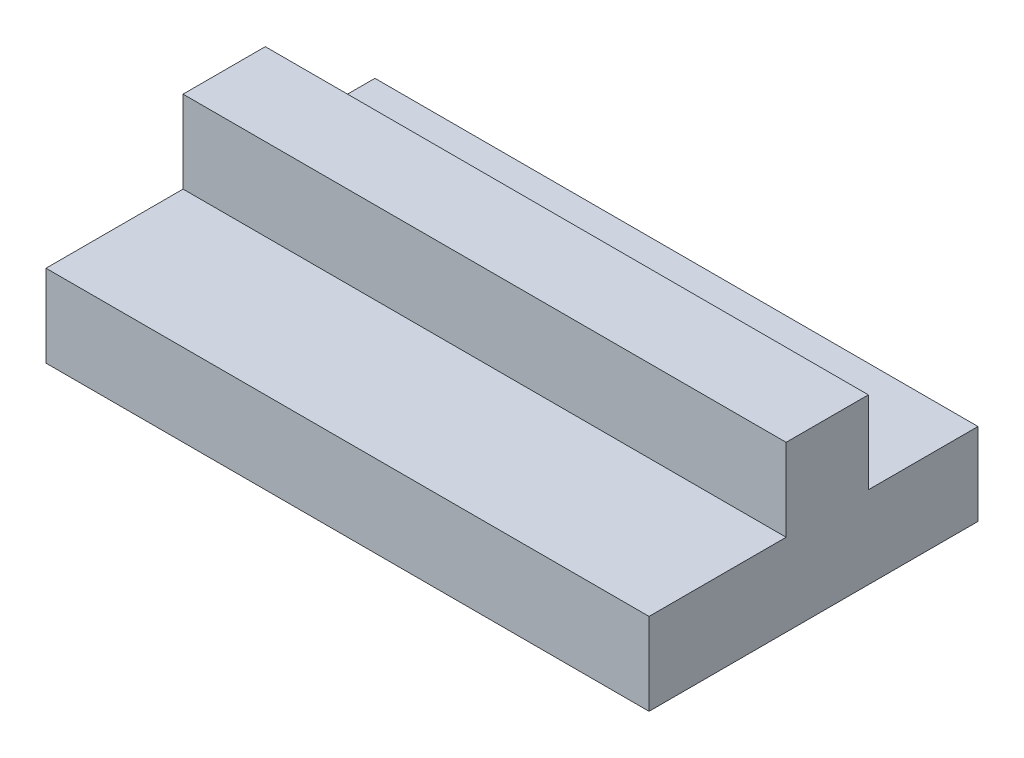
ISO-10303-21;
HEADER;
FILE_DESCRIPTION(('STEP AP214'),'2;1');
FILE_NAME('part.step','',(''),(''),'','','');
FILE_SCHEMA(('AUTOMOTIVE_DESIGN { 1 0 10303 214 1 1 1 1 }'));
ENDSEC;
DATA;
#1=APPLICATION_CONTEXT('core data for automotive mechanical design processes');
#2=APPLICATION_PROTOCOL_DEFINITION('international standard','automotive_design',2000,#1);
#3=PRODUCT_CONTEXT('',#1,'mechanical');
#4=PRODUCT('Part','Part','',(#3));
#5=PRODUCT_RELATED_PRODUCT_CATEGORY('part','',(#4));
#6=PRODUCT_DEFINITION_FORMATION('','',#4);
#7=PRODUCT_DEFINITION_CONTEXT('part definition',#1,'design');
#8=PRODUCT_DEFINITION('design','',#6,#7);
#9=PRODUCT_DEFINITION_SHAPE('','',#8);
#10=(LENGTH_UNIT() NAMED_UNIT(*) SI_UNIT(.MILLI.,.METRE.));
#11=(NAMED_UNIT(*) PLANE_ANGLE_UNIT() SI_UNIT($,.RADIAN.));
#12=(NAMED_UNIT(*) SI_UNIT($,.STERADIAN.) SOLID_ANGLE_UNIT());
#13=UNCERTAINTY_MEASURE_WITH_UNIT(LENGTH_MEASURE(1.E-05),#10,'distance_accuracy_value','');
#14=(GEOMETRIC_REPRESENTATION_CONTEXT(3) GLOBAL_UNCERTAINTY_ASSIGNED_CONTEXT((#13)) GLOBAL_UNIT_ASSIGNED_CONTEXT((#10,
#11,#12)) REPRESENTATION_CONTEXT('',''));
#15=CARTESIAN_POINT('',(0.,0.,0.));
#16=DIRECTION('',(0.,0.,1.));
#17=DIRECTION('',(1.,0.,0.));
#18=AXIS2_PLACEMENT_3D('',#15,#16,#17);
#19=CARTESIAN_POINT('',(-103.,0.,24.5));
#20=DIRECTION('',(0.,-1.,0.));
#21=DIRECTION('',(0.,0.,-1.));
#22=AXIS2_PLACEMENT_3D('',#19,#20,#21);
#23=PLANE('',#22);
#24=DIRECTION('',(0.,0.,1.));
#25=VECTOR('',#24,1.);
#26=CARTESIAN_POINT('',(25.6,0.,24.5));
#27=LINE('',#26,#25);
#28=CARTESIAN_POINT('',(25.6,0.,21.5));
#29=VERTEX_POINT('',#28);
#30=CARTESIAN_POINT('',(25.6,0.,26.5));
#31=VERTEX_POINT('',#30);
#32=EDGE_CURVE('E225',#29,#31,#27,.T.);
#33=ORIENTED_EDGE('',*,*,#32,.F.);
#34=DIRECTION('',(1.,0.,0.));
#35=VECTOR('',#34,1.);
#36=CARTESIAN_POINT('',(-103.,0.,21.5));
#37=LINE('',#36,#35);
#38=CARTESIAN_POINT('',(3.60000000000001,0.,21.5));
#39=VERTEX_POINT('',#38);
#40=EDGE_CURVE('E293',#39,#29,#37,.T.);
#41=ORIENTED_EDGE('',*,*,#40,.F.);
#42=DIRECTION('',(0.,0.,-1.));
#43=VECTOR('',#42,1.);
#44=CARTESIAN_POINT('',(3.60000000000001,0.,24.5));
#45=LINE('',#44,#43);
#46=CARTESIAN_POINT('',(3.60000000000001,0.,26.5));
#47=VERTEX_POINT('',#46);
#48=EDGE_CURVE('E218',#47,#39,#45,.T.);
#49=ORIENTED_EDGE('',*,*,#48,.F.);
#50=DIRECTION('',(-1.,0.,0.));
#51=VECTOR('',#50,1.);
#52=CARTESIAN_POINT('',(103.,0.,26.5));
#53=LINE('',#52,#51);
#54=EDGE_CURVE('E299',#31,#47,#53,.T.);
#55=ORIENTED_EDGE('',*,*,#54,.F.);
#56=EDGE_LOOP('',(#33,#41,#49,#55));
#57=FACE_BOUND('',#56,.T.);
#58=ADVANCED_FACE('F69',(#57),#23,.F.);
#59=CARTESIAN_POINT('',(103.,-3.,26.5));
#60=DIRECTION('',(0.,0.,-1.));
#61=DIRECTION('',(-1.,0.,0.));
#62=AXIS2_PLACEMENT_3D('',#59,#60,#61);
#63=PLANE('',#62);
#64=DIRECTION('',(0.,-1.,0.));
#65=VECTOR('',#64,1.);
#66=CARTESIAN_POINT('',(25.6,3.,26.5));
#67=LINE('',#66,#65);
#68=CARTESIAN_POINT('',(25.6,-3.,26.5));
#69=VERTEX_POINT('',#68);
#70=EDGE_CURVE('E211',#31,#69,#67,.T.);
#71=ORIENTED_EDGE('',*,*,#70,.F.);
#72=ORIENTED_EDGE('',*,*,#54,.T.);
#73=DIRECTION('',(0.,-1.,0.));
#74=VECTOR('',#73,1.);
#75=CARTESIAN_POINT('',(3.60000000000001,3.,26.5));
#76=LINE('',#75,#74);
#77=CARTESIAN_POINT('',(3.60000000000001,-3.,26.5));
#78=VERTEX_POINT('',#77);
#79=EDGE_CURVE('E189',#47,#78,#76,.T.);
#80=ORIENTED_EDGE('',*,*,#79,.T.);
#81=DIRECTION('',(-1.,0.,0.));
#82=VECTOR('',#81,1.);
#83=CARTESIAN_POINT('',(103.,-3.,26.5));
#84=LINE('',#83,#82);
#85=EDGE_CURVE('E203',#69,#78,#84,.T.);
#86=ORIENTED_EDGE('',*,*,#85,.F.);
#87=EDGE_LOOP('',(#71,#72,#80,#86));
#88=FACE_BOUND('',#87,.T.);
#89=ADVANCED_FACE('F71',(#88),#63,.F.);
#90=CARTESIAN_POINT('',(-103.,-3.,24.5));
#91=DIRECTION('',(0.,-1.,0.));
#92=DIRECTION('',(0.,0.,-1.));
#93=AXIS2_PLACEMENT_3D('',#90,#91,#92);
#94=PLANE('',#93);
#95=DIRECTION('',(0.,0.,1.));
#96=VECTOR('',#95,1.);
#97=CARTESIAN_POINT('',(12.6,-3.,15.8));
#98=LINE('',#97,#96);
#99=CARTESIAN_POINT('',(12.6,-3.,15.8));
#100=VERTEX_POINT('',#99);
#101=CARTESIAN_POINT('',(12.6,-3.,18.));
#102=VERTEX_POINT('',#101);
#103=EDGE_CURVE('E92',#100,#102,#98,.T.);
#104=ORIENTED_EDGE('',*,*,#103,.F.);
#105=DIRECTION('',(1.,0.,0.));
#106=VECTOR('',#105,1.);
#107=CARTESIAN_POINT('',(8.4,-3.,15.8));
#108=LINE('',#107,#106);
#109=CARTESIAN_POINT('',(8.4,-3.,15.8));
#110=VERTEX_POINT('',#109);
#111=EDGE_CURVE('E232',#110,#100,#108,.T.);
#112=ORIENTED_EDGE('',*,*,#111,.F.);
#113=DIRECTION('',(0.,0.,-1.));
#114=VECTOR('',#113,1.);
#115=CARTESIAN_POINT('',(8.4,-3.,15.8));
#116=LINE('',#115,#114);
#117=CARTESIAN_POINT('',(8.4,-3.,18.));
#118=VERTEX_POINT('',#117);
#119=EDGE_CURVE('E247',#118,#110,#116,.T.);
#120=ORIENTED_EDGE('',*,*,#119,.F.);
#121=DIRECTION('',(-1.,0.,0.));
#122=VECTOR('',#121,1.);
#123=CARTESIAN_POINT('',(8.4,-3.,18.));
#124=LINE('',#123,#122);
#125=EDGE_CURVE('E243',#102,#118,#124,.T.);
#126=ORIENTED_EDGE('',*,*,#125,.F.);
#127=EDGE_LOOP('',(#104,#112,#120,#126));
#128=FACE_BOUND('',#127,.T.);
#129=DIRECTION('',(0.,0.,1.));
#130=VECTOR('',#129,1.);
#131=CARTESIAN_POINT('',(20.6,-3.,15.8));
#132=LINE('',#131,#130);
#133=CARTESIAN_POINT('',(20.6,-3.,15.8));
#134=VERTEX_POINT('',#133);
#135=CARTESIAN_POINT('',(20.6,-3.,18.));
#136=VERTEX_POINT('',#135);
#137=EDGE_CURVE('E244',#134,#136,#132,.T.);
#138=ORIENTED_EDGE('',*,*,#137,.F.);
#139=DIRECTION('',(1.,0.,0.));
#140=VECTOR('',#139,1.);
#141=CARTESIAN_POINT('',(20.6,-3.,15.8));
#142=LINE('',#141,#140);
#143=CARTESIAN_POINT('',(16.4,-3.,15.8));
#144=VERTEX_POINT('',#143);
#145=EDGE_CURVE('E269',#144,#134,#142,.T.);
#146=ORIENTED_EDGE('',*,*,#145,.F.);
#147=DIRECTION('',(0.,0.,-1.));
#148=VECTOR('',#147,1.);
#149=CARTESIAN_POINT('',(16.4,-3.,15.8));
#150=LINE('',#149,#148);
#151=CARTESIAN_POINT('',(16.4,-3.,18.));
#152=VERTEX_POINT('',#151);
#153=EDGE_CURVE('E272',#152,#144,#150,.T.);
#154=ORIENTED_EDGE('',*,*,#153,.F.);
#155=DIRECTION('',(-1.,0.,0.));
#156=VECTOR('',#155,1.);
#157=CARTESIAN_POINT('',(20.6,-3.,18.));
#158=LINE('',#157,#156);
#159=EDGE_CURVE('E276',#136,#152,#158,.T.);
#160=ORIENTED_EDGE('',*,*,#159,.F.);
#161=EDGE_LOOP('',(#138,#146,#154,#160));
#162=FACE_BOUND('',#161,.T.);
#163=DIRECTION('',(1.,0.,0.));
#164=VECTOR('',#163,1.);
#165=CARTESIAN_POINT('',(3.60000000000001,-3.,14.5));
#166=LINE('',#165,#164);
#167=CARTESIAN_POINT('',(3.60000000000001,-3.,14.5));
#168=VERTEX_POINT('',#167);
#169=CARTESIAN_POINT('',(25.6,-3.,14.5));
#170=VERTEX_POINT('',#169);
#171=EDGE_CURVE('E192',#168,#170,#166,.T.);
#172=ORIENTED_EDGE('',*,*,#171,.T.);
#173=DIRECTION('',(0.,0.,1.));
#174=VECTOR('',#173,1.);
#175=CARTESIAN_POINT('',(25.6,-3.,14.5));
#176=LINE('',#175,#174);
#177=EDGE_CURVE('E198',#170,#69,#176,.T.);
#178=ORIENTED_EDGE('',*,*,#177,.T.);
#179=ORIENTED_EDGE('',*,*,#85,.T.);
#180=DIRECTION('',(0.,0.,-1.));
#181=VECTOR('',#180,1.);
#182=CARTESIAN_POINT('',(3.60000000000001,-3.,26.5));
#183=LINE('',#182,#181);
#184=EDGE_CURVE('E183',#78,#168,#183,.T.);
#185=ORIENTED_EDGE('',*,*,#184,.T.);
#186=EDGE_LOOP('',(#172,#178,#179,#185));
#187=FACE_BOUND('',#186,.T.);
#188=ADVANCED_FACE('F201',(#128,#162,#187),#94,.T.);
#189=CARTESIAN_POINT('',(0.,3.,0.));
#190=DIRECTION('',(0.,1.,0.));
#191=DIRECTION('',(0.,0.,1.));
#192=AXIS2_PLACEMENT_3D('',#189,#190,#191);
#193=PLANE('',#192);
#194=DIRECTION('',(1.,0.,0.));
#195=VECTOR('',#194,1.);
#196=CARTESIAN_POINT('',(-103.,3.,21.5));
#197=LINE('',#196,#195);
#198=CARTESIAN_POINT('',(3.60000000000001,3.,21.5));
#199=VERTEX_POINT('',#198);
#200=CARTESIAN_POINT('',(25.6,3.,21.5));
#201=VERTEX_POINT('',#200);
#202=EDGE_CURVE('E296',#199,#201,#197,.T.);
#203=ORIENTED_EDGE('',*,*,#202,.T.);
#204=DIRECTION('',(0.,0.,1.));
#205=VECTOR('',#204,1.);
#206=CARTESIAN_POINT('',(25.6,3.,14.5));
#207=LINE('',#206,#205);
#208=CARTESIAN_POINT('',(25.6,3.,18.5));
#209=VERTEX_POINT('',#208);
#210=EDGE_CURVE('E206',#209,#201,#207,.T.);
#211=ORIENTED_EDGE('',*,*,#210,.F.);
#212=DIRECTION('',(1.,0.,0.));
#213=VECTOR('',#212,1.);
#214=CARTESIAN_POINT('',(-103.,3.,18.5));
#215=LINE('',#214,#213);
#216=CARTESIAN_POINT('',(3.60000000000001,3.,18.5));
#217=VERTEX_POINT('',#216);
#218=EDGE_CURVE('E290',#217,#209,#215,.T.);
#219=ORIENTED_EDGE('',*,*,#218,.F.);
#220=DIRECTION('',(0.,0.,-1.));
#221=VECTOR('',#220,1.);
#222=CARTESIAN_POINT('',(3.60000000000001,3.,26.5));
#223=LINE('',#222,#221);
#224=EDGE_CURVE('E210',#199,#217,#223,.T.);
#225=ORIENTED_EDGE('',*,*,#224,.F.);
#226=EDGE_LOOP('',(#203,#211,#219,#225));
#227=FACE_BOUND('',#226,.T.);
#228=ADVANCED_FACE('F317',(#227),#193,.T.);
#229=CARTESIAN_POINT('',(-103.,3.,21.5));
#230=DIRECTION('',(0.,0.,-1.));
#231=DIRECTION('',(-1.,0.,0.));
#232=AXIS2_PLACEMENT_3D('',#229,#230,#231);
#233=PLANE('',#232);
#234=DIRECTION('',(0.,-1.,0.));
#235=VECTOR('',#234,1.);
#236=CARTESIAN_POINT('',(25.6,3.,21.5));
#237=LINE('',#236,#235);
#238=EDGE_CURVE('E223',#201,#29,#237,.T.);
#239=ORIENTED_EDGE('',*,*,#238,.F.);
#240=ORIENTED_EDGE('',*,*,#202,.F.);
#241=DIRECTION('',(0.,1.,0.));
#242=VECTOR('',#241,1.);
#243=CARTESIAN_POINT('',(3.60000000000001,3.,21.5));
#244=LINE('',#243,#242);
#245=EDGE_CURVE('E216',#39,#199,#244,.T.);
#246=ORIENTED_EDGE('',*,*,#245,.F.);
#247=ORIENTED_EDGE('',*,*,#40,.T.);
#248=EDGE_LOOP('',(#239,#240,#246,#247));
#249=FACE_BOUND('',#248,.T.);
#250=ADVANCED_FACE('F322',(#249),#233,.F.);
#251=CARTESIAN_POINT('',(-103.,3.,18.5));
#252=DIRECTION('',(0.,0.,-1.));
#253=DIRECTION('',(-1.,0.,0.));
#254=AXIS2_PLACEMENT_3D('',#251,#252,#253);
#255=PLANE('',#254);
#256=ORIENTED_EDGE('',*,*,#218,.T.);
#257=DIRECTION('',(0.,-1.,0.));
#258=VECTOR('',#257,1.);
#259=CARTESIAN_POINT('',(25.6,3.,18.5));
#260=LINE('',#259,#258);
#261=CARTESIAN_POINT('',(25.6,0.,18.5));
#262=VERTEX_POINT('',#261);
#263=EDGE_CURVE('E220',#209,#262,#260,.T.);
#264=ORIENTED_EDGE('',*,*,#263,.T.);
#265=DIRECTION('',(1.,0.,0.));
#266=VECTOR('',#265,1.);
#267=CARTESIAN_POINT('',(-103.,0.,18.5));
#268=LINE('',#267,#266);
#269=CARTESIAN_POINT('',(3.60000000000001,0.,18.5));
#270=VERTEX_POINT('',#269);
#271=EDGE_CURVE('E254',#270,#262,#268,.T.);
#272=ORIENTED_EDGE('',*,*,#271,.F.);
#273=DIRECTION('',(0.,1.,0.));
#274=VECTOR('',#273,1.);
#275=CARTESIAN_POINT('',(3.60000000000001,3.,18.5));
#276=LINE('',#275,#274);
#277=EDGE_CURVE('E84',#270,#217,#276,.T.);
#278=ORIENTED_EDGE('',*,*,#277,.T.);
#279=EDGE_LOOP('',(#256,#264,#272,#278));
#280=FACE_BOUND('',#279,.T.);
#281=ADVANCED_FACE('F312',(#280),#255,.T.);
#282=DIRECTION('',(1.,0.,0.));
#283=VECTOR('',#282,1.);
#284=CARTESIAN_POINT('',(20.6,0.,15.8));
#285=LINE('',#284,#283);
#286=CARTESIAN_POINT('',(16.4,0.,15.8));
#287=VERTEX_POINT('',#286);
#288=CARTESIAN_POINT('',(20.6,0.,15.8));
#289=VERTEX_POINT('',#288);
#290=EDGE_CURVE('E263',#287,#289,#285,.T.);
#291=ORIENTED_EDGE('',*,*,#290,.T.);
#292=DIRECTION('',(0.,0.,1.));
#293=VECTOR('',#292,1.);
#294=CARTESIAN_POINT('',(20.6,0.,15.8));
#295=LINE('',#294,#293);
#296=CARTESIAN_POINT('',(20.6,0.,18.));
#297=VERTEX_POINT('',#296);
#298=EDGE_CURVE('E273',#289,#297,#295,.T.);
#299=ORIENTED_EDGE('',*,*,#298,.T.);
#300=DIRECTION('',(-1.,0.,0.));
#301=VECTOR('',#300,1.);
#302=CARTESIAN_POINT('',(20.6,0.,18.));
#303=LINE('',#302,#301);
#304=CARTESIAN_POINT('',(16.4,0.,18.));
#305=VERTEX_POINT('',#304);
#306=EDGE_CURVE('E285',#297,#305,#303,.T.);
#307=ORIENTED_EDGE('',*,*,#306,.T.);
#308=DIRECTION('',(0.,0.,-1.));
#309=VECTOR('',#308,1.);
#310=CARTESIAN_POINT('',(16.4,0.,15.8));
#311=LINE('',#310,#309);
#312=EDGE_CURVE('E282',#305,#287,#311,.T.);
#313=ORIENTED_EDGE('',*,*,#312,.T.);
#314=EDGE_LOOP('',(#291,#299,#307,#313));
#315=FACE_BOUND('',#314,.T.);
#316=DIRECTION('',(1.,0.,0.));
#317=VECTOR('',#316,1.);
#318=CARTESIAN_POINT('',(8.4,0.,15.8));
#319=LINE('',#318,#317);
#320=CARTESIAN_POINT('',(8.4,0.,15.8));
#321=VERTEX_POINT('',#320);
#322=CARTESIAN_POINT('',(12.6,0.,15.8));
#323=VERTEX_POINT('',#322);
#324=EDGE_CURVE('E238',#321,#323,#319,.T.);
#325=ORIENTED_EDGE('',*,*,#324,.T.);
#326=DIRECTION('',(0.,0.,1.));
#327=VECTOR('',#326,1.);
#328=CARTESIAN_POINT('',(12.6,0.,15.8));
#329=LINE('',#328,#327);
#330=CARTESIAN_POINT('',(12.6,0.,18.));
#331=VERTEX_POINT('',#330);
#332=EDGE_CURVE('E228',#323,#331,#329,.T.);
#333=ORIENTED_EDGE('',*,*,#332,.T.);
#334=DIRECTION('',(-1.,0.,0.));
#335=VECTOR('',#334,1.);
#336=CARTESIAN_POINT('',(8.4,0.,18.));
#337=LINE('',#336,#335);
#338=CARTESIAN_POINT('',(8.4,0.,18.));
#339=VERTEX_POINT('',#338);
#340=EDGE_CURVE('E231',#331,#339,#337,.T.);
#341=ORIENTED_EDGE('',*,*,#340,.T.);
#342=DIRECTION('',(0.,0.,-1.));
#343=VECTOR('',#342,1.);
#344=CARTESIAN_POINT('',(8.4,0.,15.8));
#345=LINE('',#344,#343);
#346=EDGE_CURVE('E235',#339,#321,#345,.T.);
#347=ORIENTED_EDGE('',*,*,#346,.T.);
#348=EDGE_LOOP('',(#325,#333,#341,#347));
#349=FACE_BOUND('',#348,.T.);
#350=DIRECTION('',(0.,0.,1.));
#351=VECTOR('',#350,1.);
#352=CARTESIAN_POINT('',(25.6,0.,24.5));
#353=LINE('',#352,#351);
#354=CARTESIAN_POINT('',(25.6,0.,14.5));
#355=VERTEX_POINT('',#354);
#356=EDGE_CURVE('E13',#355,#262,#353,.T.);
#357=ORIENTED_EDGE('',*,*,#356,.F.);
#358=DIRECTION('',(1.,0.,0.));
#359=VECTOR('',#358,1.);
#360=CARTESIAN_POINT('',(-103.,0.,14.5));
#361=LINE('',#360,#359);
#362=CARTESIAN_POINT('',(3.60000000000001,0.,14.5));
#363=VERTEX_POINT('',#362);
#364=EDGE_CURVE('E77',#363,#355,#361,.T.);
#365=ORIENTED_EDGE('',*,*,#364,.F.);
#366=DIRECTION('',(0.,0.,-1.));
#367=VECTOR('',#366,1.);
#368=CARTESIAN_POINT('',(3.60000000000001,0.,24.5));
#369=LINE('',#368,#367);
#370=EDGE_CURVE('E185',#270,#363,#369,.T.);
#371=ORIENTED_EDGE('',*,*,#370,.F.);
#372=ORIENTED_EDGE('',*,*,#271,.T.);
#373=EDGE_LOOP('',(#357,#365,#371,#372));
#374=FACE_BOUND('',#373,.T.);
#375=ADVANCED_FACE('F309',(#315,#349,#374),#23,.F.);
#376=CARTESIAN_POINT('',(20.6,0.,15.8));
#377=DIRECTION('',(1.,0.,0.));
#378=DIRECTION('',(0.,0.,-1.));
#379=AXIS2_PLACEMENT_3D('',#376,#377,#378);
#380=PLANE('',#379);
#381=ORIENTED_EDGE('',*,*,#137,.T.);
#382=DIRECTION('',(0.,-1.,0.));
#383=VECTOR('',#382,1.);
#384=CARTESIAN_POINT('',(20.6,0.,18.));
#385=LINE('',#384,#383);
#386=EDGE_CURVE('E260',#297,#136,#385,.T.);
#387=ORIENTED_EDGE('',*,*,#386,.F.);
#388=ORIENTED_EDGE('',*,*,#298,.F.);
#389=DIRECTION('',(0.,-1.,0.));
#390=VECTOR('',#389,1.);
#391=CARTESIAN_POINT('',(20.6,0.,15.8));
#392=LINE('',#391,#390);
#393=EDGE_CURVE('E227',#289,#134,#392,.T.);
#394=ORIENTED_EDGE('',*,*,#393,.T.);
#395=EDGE_LOOP('',(#381,#387,#388,#394));
#396=FACE_BOUND('',#395,.T.);
#397=ADVANCED_FACE('F341',(#396),#380,.F.);
#398=CARTESIAN_POINT('',(20.6,0.,15.8));
#399=DIRECTION('',(0.,0.,-1.));
#400=DIRECTION('',(-1.,0.,0.));
#401=AXIS2_PLACEMENT_3D('',#398,#399,#400);
#402=PLANE('',#401);
#403=ORIENTED_EDGE('',*,*,#145,.T.);
#404=ORIENTED_EDGE('',*,*,#393,.F.);
#405=ORIENTED_EDGE('',*,*,#290,.F.);
#406=DIRECTION('',(0.,-1.,0.));
#407=VECTOR('',#406,1.);
#408=CARTESIAN_POINT('',(16.4,0.,15.8));
#409=LINE('',#408,#407);
#410=EDGE_CURVE('E266',#287,#144,#409,.T.);
#411=ORIENTED_EDGE('',*,*,#410,.T.);
#412=EDGE_LOOP('',(#403,#404,#405,#411));
#413=FACE_BOUND('',#412,.T.);
#414=ADVANCED_FACE('F348',(#413),#402,.F.);
#415=CARTESIAN_POINT('',(16.4,0.,15.8));
#416=DIRECTION('',(-1.,0.,0.));
#417=DIRECTION('',(0.,0.,1.));
#418=AXIS2_PLACEMENT_3D('',#415,#416,#417);
#419=PLANE('',#418);
#420=ORIENTED_EDGE('',*,*,#153,.T.);
#421=ORIENTED_EDGE('',*,*,#410,.F.);
#422=ORIENTED_EDGE('',*,*,#312,.F.);
#423=DIRECTION('',(0.,-1.,0.));
#424=VECTOR('',#423,1.);
#425=CARTESIAN_POINT('',(16.4,0.,18.));
#426=LINE('',#425,#424);
#427=EDGE_CURVE('E264',#305,#152,#426,.T.);
#428=ORIENTED_EDGE('',*,*,#427,.T.);
#429=EDGE_LOOP('',(#420,#421,#422,#428));
#430=FACE_BOUND('',#429,.T.);
#431=ADVANCED_FACE('F379',(#430),#419,.F.);
#432=CARTESIAN_POINT('',(20.6,0.,18.));
#433=DIRECTION('',(0.,0.,1.));
#434=DIRECTION('',(1.,0.,0.));
#435=AXIS2_PLACEMENT_3D('',#432,#433,#434);
#436=PLANE('',#435);
#437=ORIENTED_EDGE('',*,*,#159,.T.);
#438=ORIENTED_EDGE('',*,*,#427,.F.);
#439=ORIENTED_EDGE('',*,*,#306,.F.);
#440=ORIENTED_EDGE('',*,*,#386,.T.);
#441=EDGE_LOOP('',(#437,#438,#439,#440));
#442=FACE_BOUND('',#441,.T.);
#443=ADVANCED_FACE('F376',(#442),#436,.F.);
#444=CARTESIAN_POINT('',(12.6,0.,15.8));
#445=DIRECTION('',(1.,0.,0.));
#446=DIRECTION('',(0.,0.,-1.));
#447=AXIS2_PLACEMENT_3D('',#444,#445,#446);
#448=PLANE('',#447);
#449=ORIENTED_EDGE('',*,*,#103,.T.);
#450=DIRECTION('',(0.,-1.,0.));
#451=VECTOR('',#450,1.);
#452=CARTESIAN_POINT('',(12.6,0.,18.));
#453=LINE('',#452,#451);
#454=EDGE_CURVE('E241',#331,#102,#453,.T.);
#455=ORIENTED_EDGE('',*,*,#454,.F.);
#456=ORIENTED_EDGE('',*,*,#332,.F.);
#457=DIRECTION('',(0.,-1.,0.));
#458=VECTOR('',#457,1.);
#459=CARTESIAN_POINT('',(12.6,0.,15.8));
#460=LINE('',#459,#458);
#461=EDGE_CURVE('E252',#323,#100,#460,.T.);
#462=ORIENTED_EDGE('',*,*,#461,.T.);
#463=EDGE_LOOP('',(#449,#455,#456,#462));
#464=FACE_BOUND('',#463,.T.);
#465=ADVANCED_FACE('F359',(#464),#448,.F.);
#466=CARTESIAN_POINT('',(8.4,0.,15.8));
#467=DIRECTION('',(0.,0.,-1.));
#468=DIRECTION('',(-1.,0.,0.));
#469=AXIS2_PLACEMENT_3D('',#466,#467,#468);
#470=PLANE('',#469);
#471=ORIENTED_EDGE('',*,*,#111,.T.);
#472=ORIENTED_EDGE('',*,*,#461,.F.);
#473=ORIENTED_EDGE('',*,*,#324,.F.);
#474=DIRECTION('',(0.,-1.,0.));
#475=VECTOR('',#474,1.);
#476=CARTESIAN_POINT('',(8.4,0.,15.8));
#477=LINE('',#476,#475);
#478=EDGE_CURVE('E255',#321,#110,#477,.T.);
#479=ORIENTED_EDGE('',*,*,#478,.T.);
#480=EDGE_LOOP('',(#471,#472,#473,#479));
#481=FACE_BOUND('',#480,.T.);
#482=ADVANCED_FACE('F357',(#481),#470,.F.);
#483=CARTESIAN_POINT('',(8.4,0.,15.8));
#484=DIRECTION('',(-1.,0.,0.));
#485=DIRECTION('',(0.,0.,1.));
#486=AXIS2_PLACEMENT_3D('',#483,#484,#485);
#487=PLANE('',#486);
#488=ORIENTED_EDGE('',*,*,#119,.T.);
#489=ORIENTED_EDGE('',*,*,#478,.F.);
#490=ORIENTED_EDGE('',*,*,#346,.F.);
#491=DIRECTION('',(0.,-1.,0.));
#492=VECTOR('',#491,1.);
#493=CARTESIAN_POINT('',(8.4,0.,18.));
#494=LINE('',#493,#492);
#495=EDGE_CURVE('E257',#339,#118,#494,.T.);
#496=ORIENTED_EDGE('',*,*,#495,.T.);
#497=EDGE_LOOP('',(#488,#489,#490,#496));
#498=FACE_BOUND('',#497,.T.);
#499=ADVANCED_FACE('F367',(#498),#487,.F.);
#500=CARTESIAN_POINT('',(8.4,0.,18.));
#501=DIRECTION('',(0.,0.,1.));
#502=DIRECTION('',(1.,0.,0.));
#503=AXIS2_PLACEMENT_3D('',#500,#501,#502);
#504=PLANE('',#503);
#505=ORIENTED_EDGE('',*,*,#125,.T.);
#506=ORIENTED_EDGE('',*,*,#495,.F.);
#507=ORIENTED_EDGE('',*,*,#340,.F.);
#508=ORIENTED_EDGE('',*,*,#454,.T.);
#509=EDGE_LOOP('',(#505,#506,#507,#508));
#510=FACE_BOUND('',#509,.T.);
#511=ADVANCED_FACE('F364',(#510),#504,.F.);
#512=CARTESIAN_POINT('',(25.6,3.,14.5));
#513=DIRECTION('',(1.,0.,0.));
#514=DIRECTION('',(0.,0.,-1.));
#515=AXIS2_PLACEMENT_3D('',#512,#513,#514);
#516=PLANE('',#515);
#517=ORIENTED_EDGE('',*,*,#32,.T.);
#518=ORIENTED_EDGE('',*,*,#70,.T.);
#519=ORIENTED_EDGE('',*,*,#177,.F.);
#520=DIRECTION('',(0.,-1.,0.));
#521=VECTOR('',#520,1.);
#522=CARTESIAN_POINT('',(25.6,3.,14.5));
#523=LINE('',#522,#521);
#524=EDGE_CURVE('E188',#355,#170,#523,.T.);
#525=ORIENTED_EDGE('',*,*,#524,.F.);
#526=ORIENTED_EDGE('',*,*,#356,.T.);
#527=ORIENTED_EDGE('',*,*,#263,.F.);
#528=ORIENTED_EDGE('',*,*,#210,.T.);
#529=ORIENTED_EDGE('',*,*,#238,.T.);
#530=EDGE_LOOP('',(#517,#518,#519,#525,#526,#527,#528,#529));
#531=FACE_BOUND('',#530,.T.);
#532=ADVANCED_FACE('F308',(#531),#516,.T.);
#533=CARTESIAN_POINT('',(3.60000000000001,3.,14.5));
#534=DIRECTION('',(0.,0.,-1.));
#535=DIRECTION('',(-1.,0.,0.));
#536=AXIS2_PLACEMENT_3D('',#533,#534,#535);
#537=PLANE('',#536);
#538=ORIENTED_EDGE('',*,*,#364,.T.);
#539=ORIENTED_EDGE('',*,*,#524,.T.);
#540=ORIENTED_EDGE('',*,*,#171,.F.);
#541=DIRECTION('',(0.,-1.,0.));
#542=VECTOR('',#541,1.);
#543=CARTESIAN_POINT('',(3.60000000000001,3.,14.5));
#544=LINE('',#543,#542);
#545=EDGE_CURVE('E179',#363,#168,#544,.T.);
#546=ORIENTED_EDGE('',*,*,#545,.F.);
#547=EDGE_LOOP('',(#538,#539,#540,#546));
#548=FACE_BOUND('',#547,.T.);
#549=ADVANCED_FACE('F193',(#548),#537,.T.);
#550=CARTESIAN_POINT('',(3.60000000000001,3.,26.5));
#551=DIRECTION('',(-1.,0.,0.));
#552=DIRECTION('',(0.,0.,1.));
#553=AXIS2_PLACEMENT_3D('',#550,#551,#552);
#554=PLANE('',#553);
#555=ORIENTED_EDGE('',*,*,#48,.T.);
#556=ORIENTED_EDGE('',*,*,#245,.T.);
#557=ORIENTED_EDGE('',*,*,#224,.T.);
#558=ORIENTED_EDGE('',*,*,#277,.F.);
#559=ORIENTED_EDGE('',*,*,#370,.T.);
#560=ORIENTED_EDGE('',*,*,#545,.T.);
#561=ORIENTED_EDGE('',*,*,#184,.F.);
#562=ORIENTED_EDGE('',*,*,#79,.F.);
#563=EDGE_LOOP('',(#555,#556,#557,#558,#559,#560,#561,#562));
#564=FACE_BOUND('',#563,.T.);
#565=ADVANCED_FACE('F181',(#564),#554,.T.);
#566=CLOSED_SHELL('',(#58,#89,#188,#228,#250,#281,#375,#397,#414,#431,#443,#465,#482,#499,#511,
#532,#549,#565));
#567=MANIFOLD_SOLID_BREP('B2',#566);
#568=ADVANCED_BREP_SHAPE_REPRESENTATION('',(#18,#567),#14);
#569=SHAPE_DEFINITION_REPRESENTATION(#9,#568);
ENDSEC;
END-ISO-10303-21;
